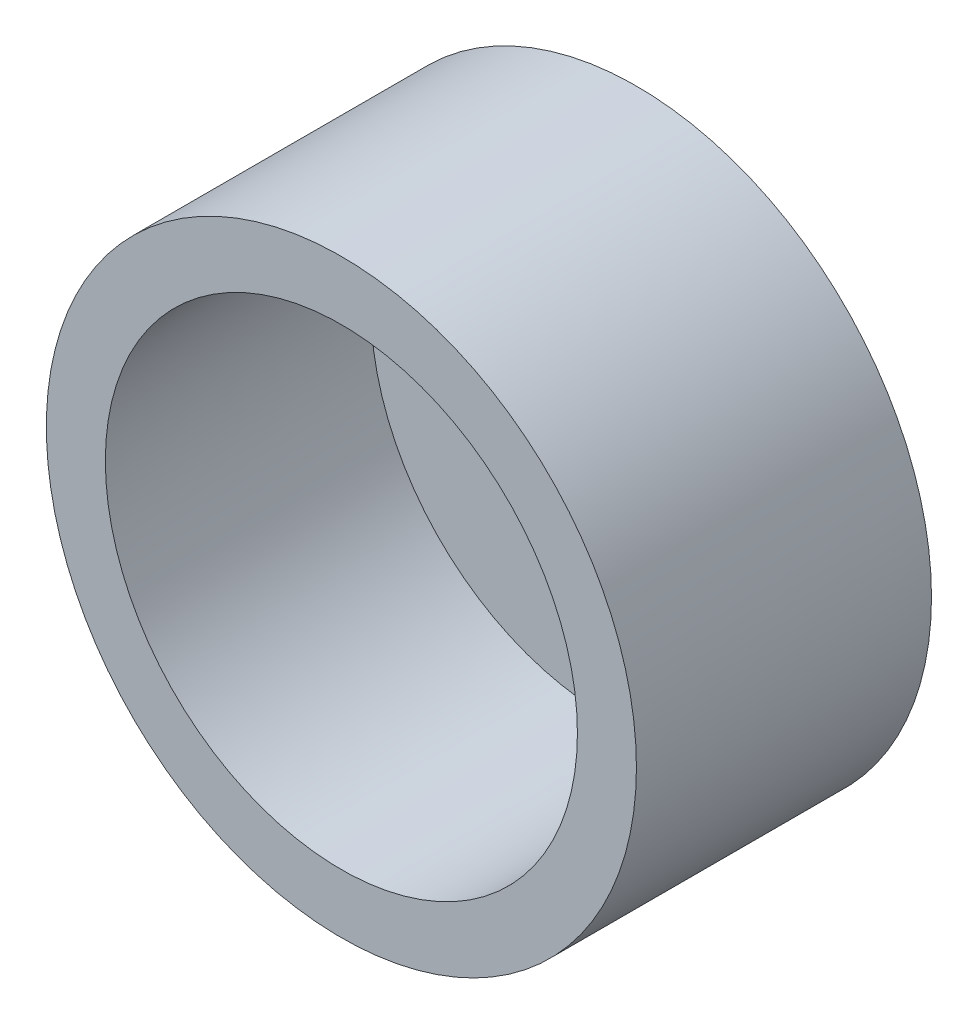
ISO-10303-21;
HEADER;
FILE_DESCRIPTION(('STEP AP214'),'2;1');
FILE_NAME('part.step','',(''),(''),'','','');
FILE_SCHEMA(('AUTOMOTIVE_DESIGN { 1 0 10303 214 1 1 1 1 }'));
ENDSEC;
DATA;
#1=APPLICATION_CONTEXT('core data for automotive mechanical design processes');
#2=APPLICATION_PROTOCOL_DEFINITION('international standard','automotive_design',2000,#1);
#3=PRODUCT_CONTEXT('',#1,'mechanical');
#4=PRODUCT('Part','Part','',(#3));
#5=PRODUCT_RELATED_PRODUCT_CATEGORY('part','',(#4));
#6=PRODUCT_DEFINITION_FORMATION('','',#4);
#7=PRODUCT_DEFINITION_CONTEXT('part definition',#1,'design');
#8=PRODUCT_DEFINITION('design','',#6,#7);
#9=PRODUCT_DEFINITION_SHAPE('','',#8);
#10=(LENGTH_UNIT() NAMED_UNIT(*) SI_UNIT(.MILLI.,.METRE.));
#11=(NAMED_UNIT(*) PLANE_ANGLE_UNIT() SI_UNIT($,.RADIAN.));
#12=(NAMED_UNIT(*) SI_UNIT($,.STERADIAN.) SOLID_ANGLE_UNIT());
#13=UNCERTAINTY_MEASURE_WITH_UNIT(LENGTH_MEASURE(1.E-05),#10,'distance_accuracy_value','');
#14=(GEOMETRIC_REPRESENTATION_CONTEXT(3) GLOBAL_UNCERTAINTY_ASSIGNED_CONTEXT((#13)) GLOBAL_UNIT_ASSIGNED_CONTEXT((#10,
#11,#12)) REPRESENTATION_CONTEXT('',''));
#15=CARTESIAN_POINT('',(0.,0.,0.));
#16=DIRECTION('',(0.,0.,1.));
#17=DIRECTION('',(1.,0.,0.));
#18=AXIS2_PLACEMENT_3D('',#15,#16,#17);
#19=CARTESIAN_POINT('',(0.,0.,5.));
#20=DIRECTION('',(0.,0.,-1.));
#21=DIRECTION('',(-1.,0.,0.));
#22=AXIS2_PLACEMENT_3D('',#19,#20,#21);
#23=CYLINDRICAL_SURFACE('',#22,5.);
#24=CARTESIAN_POINT('',(0.,0.,5.));
#25=DIRECTION('',(0.,0.,1.));
#26=DIRECTION('',(1.,0.,0.));
#27=AXIS2_PLACEMENT_3D('',#24,#25,#26);
#28=CIRCLE('',#27,5.);
#29=CARTESIAN_POINT('',(5.,0.,5.));
#30=VERTEX_POINT('',#29);
#31=EDGE_CURVE('E10',#30,#30,#28,.T.);
#32=ORIENTED_EDGE('',*,*,#31,.F.);
#33=EDGE_LOOP('',(#32));
#34=FACE_BOUND('',#33,.T.);
#35=CARTESIAN_POINT('',(0.,0.,0.));
#36=DIRECTION('',(0.,0.,1.));
#37=DIRECTION('',(1.,0.,0.));
#38=AXIS2_PLACEMENT_3D('',#35,#36,#37);
#39=CIRCLE('',#38,5.);
#40=CARTESIAN_POINT('',(5.,0.,0.));
#41=VERTEX_POINT('',#40);
#42=EDGE_CURVE('E44',#41,#41,#39,.T.);
#43=ORIENTED_EDGE('',*,*,#42,.T.);
#44=EDGE_LOOP('',(#43));
#45=FACE_BOUND('',#44,.T.);
#46=ADVANCED_FACE('F41',(#34,#45),#23,.T.);
#47=CARTESIAN_POINT('',(0.,0.,5.));
#48=DIRECTION('',(0.,0.,1.));
#49=DIRECTION('',(1.,0.,0.));
#50=AXIS2_PLACEMENT_3D('',#47,#48,#49);
#51=PLANE('',#50);
#52=CARTESIAN_POINT('',(0.,0.,5.));
#53=DIRECTION('',(0.,0.,1.));
#54=DIRECTION('',(1.,0.,0.));
#55=AXIS2_PLACEMENT_3D('',#52,#53,#54);
#56=CIRCLE('',#55,4.);
#57=CARTESIAN_POINT('',(4.,0.,5.));
#58=VERTEX_POINT('',#57);
#59=EDGE_CURVE('E55',#58,#58,#56,.T.);
#60=ORIENTED_EDGE('',*,*,#59,.F.);
#61=EDGE_LOOP('',(#60));
#62=FACE_BOUND('',#61,.T.);
#63=ORIENTED_EDGE('',*,*,#31,.T.);
#64=EDGE_LOOP('',(#63));
#65=FACE_BOUND('',#64,.T.);
#66=ADVANCED_FACE('F103',(#62,#65),#51,.T.);
#67=CARTESIAN_POINT('',(0.,0.,0.));
#68=DIRECTION('',(0.,0.,1.));
#69=DIRECTION('',(1.,0.,0.));
#70=AXIS2_PLACEMENT_3D('',#67,#68,#69);
#71=PLANE('',#70);
#72=CARTESIAN_POINT('',(1.29,0.,0.));
#73=DIRECTION('',(0.,0.,1.));
#74=DIRECTION('',(1.,0.,0.));
#75=AXIS2_PLACEMENT_3D('',#72,#73,#74);
#76=CIRCLE('',#75,0.3);
#77=CARTESIAN_POINT('',(1.59,0.,0.));
#78=VERTEX_POINT('',#77);
#79=EDGE_CURVE('E59',#78,#78,#76,.T.);
#80=ORIENTED_EDGE('',*,*,#79,.T.);
#81=EDGE_LOOP('',(#80));
#82=FACE_BOUND('',#81,.T.);
#83=CARTESIAN_POINT('',(-1.29,0.,0.));
#84=DIRECTION('',(0.,0.,1.));
#85=DIRECTION('',(1.,0.,0.));
#86=AXIS2_PLACEMENT_3D('',#83,#84,#85);
#87=CIRCLE('',#86,0.3);
#88=CARTESIAN_POINT('',(-0.99,0.,0.));
#89=VERTEX_POINT('',#88);
#90=EDGE_CURVE('E63',#89,#89,#87,.T.);
#91=ORIENTED_EDGE('',*,*,#90,.T.);
#92=EDGE_LOOP('',(#91));
#93=FACE_BOUND('',#92,.T.);
#94=ORIENTED_EDGE('',*,*,#42,.F.);
#95=EDGE_LOOP('',(#94));
#96=FACE_BOUND('',#95,.T.);
#97=ADVANCED_FACE('F79',(#82,#93,#96),#71,.F.);
#98=CARTESIAN_POINT('',(0.,0.,0.5));
#99=DIRECTION('',(0.,0.,1.));
#100=DIRECTION('',(1.,0.,0.));
#101=AXIS2_PLACEMENT_3D('',#98,#99,#100);
#102=CYLINDRICAL_SURFACE('',#101,4.);
#103=CARTESIAN_POINT('',(0.,0.,0.5));
#104=DIRECTION('',(0.,0.,1.));
#105=DIRECTION('',(1.,0.,0.));
#106=AXIS2_PLACEMENT_3D('',#103,#104,#105);
#107=CIRCLE('',#106,4.);
#108=CARTESIAN_POINT('',(4.,0.,0.5));
#109=VERTEX_POINT('',#108);
#110=EDGE_CURVE('E53',#109,#109,#107,.T.);
#111=ORIENTED_EDGE('',*,*,#110,.F.);
#112=EDGE_LOOP('',(#111));
#113=FACE_BOUND('',#112,.T.);
#114=ORIENTED_EDGE('',*,*,#59,.T.);
#115=EDGE_LOOP('',(#114));
#116=FACE_BOUND('',#115,.T.);
#117=ADVANCED_FACE('F92',(#113,#116),#102,.F.);
#118=CARTESIAN_POINT('',(0.,0.,0.5));
#119=DIRECTION('',(0.,0.,1.));
#120=DIRECTION('',(1.,0.,0.));
#121=AXIS2_PLACEMENT_3D('',#118,#119,#120);
#122=PLANE('',#121);
#123=CARTESIAN_POINT('',(1.29,0.,0.5));
#124=DIRECTION('',(0.,0.,1.));
#125=DIRECTION('',(1.,0.,0.));
#126=AXIS2_PLACEMENT_3D('',#123,#124,#125);
#127=CIRCLE('',#126,0.3);
#128=CARTESIAN_POINT('',(1.59,0.,0.5));
#129=VERTEX_POINT('',#128);
#130=EDGE_CURVE('E71',#129,#129,#127,.T.);
#131=ORIENTED_EDGE('',*,*,#130,.F.);
#132=EDGE_LOOP('',(#131));
#133=FACE_BOUND('',#132,.T.);
#134=CARTESIAN_POINT('',(-1.29,0.,0.5));
#135=DIRECTION('',(0.,0.,1.));
#136=DIRECTION('',(1.,0.,0.));
#137=AXIS2_PLACEMENT_3D('',#134,#135,#136);
#138=CIRCLE('',#137,0.3);
#139=CARTESIAN_POINT('',(-0.99,0.,0.5));
#140=VERTEX_POINT('',#139);
#141=EDGE_CURVE('E67',#140,#140,#138,.T.);
#142=ORIENTED_EDGE('',*,*,#141,.F.);
#143=EDGE_LOOP('',(#142));
#144=FACE_BOUND('',#143,.T.);
#145=ORIENTED_EDGE('',*,*,#110,.T.);
#146=EDGE_LOOP('',(#145));
#147=FACE_BOUND('',#146,.T.);
#148=ADVANCED_FACE('F89',(#133,#144,#147),#122,.T.);
#149=CARTESIAN_POINT('',(-1.29,0.,0.));
#150=DIRECTION('',(0.,0.,1.));
#151=DIRECTION('',(1.,0.,0.));
#152=AXIS2_PLACEMENT_3D('',#149,#150,#151);
#153=CYLINDRICAL_SURFACE('',#152,0.3);
#154=ORIENTED_EDGE('',*,*,#90,.F.);
#155=EDGE_LOOP('',(#154));
#156=FACE_BOUND('',#155,.T.);
#157=ORIENTED_EDGE('',*,*,#141,.T.);
#158=EDGE_LOOP('',(#157));
#159=FACE_BOUND('',#158,.T.);
#160=ADVANCED_FACE('F85',(#156,#159),#153,.F.);
#161=CARTESIAN_POINT('',(1.29,0.,0.));
#162=DIRECTION('',(0.,0.,1.));
#163=DIRECTION('',(1.,0.,0.));
#164=AXIS2_PLACEMENT_3D('',#161,#162,#163);
#165=CYLINDRICAL_SURFACE('',#164,0.3);
#166=ORIENTED_EDGE('',*,*,#79,.F.);
#167=EDGE_LOOP('',(#166));
#168=FACE_BOUND('',#167,.T.);
#169=ORIENTED_EDGE('',*,*,#130,.T.);
#170=EDGE_LOOP('',(#169));
#171=FACE_BOUND('',#170,.T.);
#172=ADVANCED_FACE('F82',(#168,#171),#165,.F.);
#173=CLOSED_SHELL('',(#46,#66,#97,#117,#148,#160,#172));
#174=MANIFOLD_SOLID_BREP('B2',#173);
#175=ADVANCED_BREP_SHAPE_REPRESENTATION('',(#18,#174),#14);
#176=SHAPE_DEFINITION_REPRESENTATION(#9,#175);
ENDSEC;
END-ISO-10303-21;
